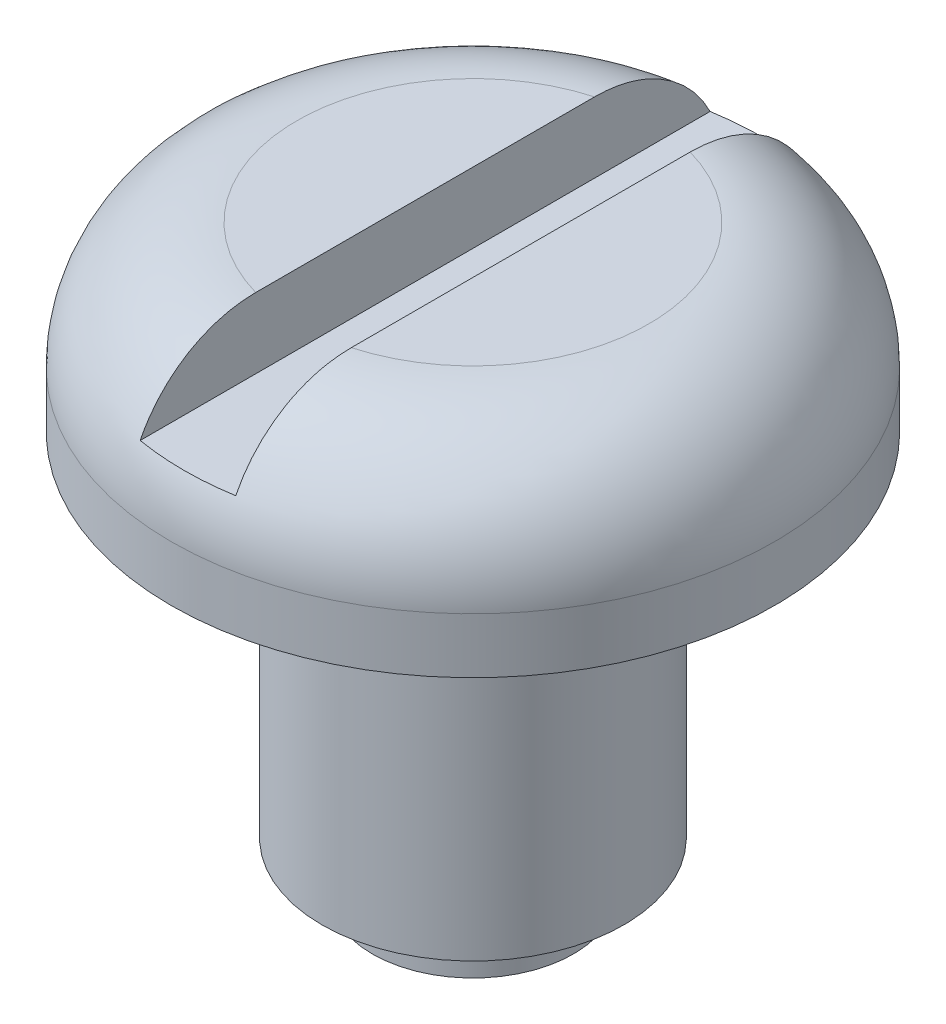
ISO-10303-21;
HEADER;
FILE_DESCRIPTION(('STEP AP214'),'2;1');
FILE_NAME('part.step','',(''),(''),'','','');
FILE_SCHEMA(('AUTOMOTIVE_DESIGN { 1 0 10303 214 1 1 1 1 }'));
ENDSEC;
DATA;
#1=APPLICATION_CONTEXT('core data for automotive mechanical design processes');
#2=APPLICATION_PROTOCOL_DEFINITION('international standard','automotive_design',2000,#1);
#3=PRODUCT_CONTEXT('',#1,'mechanical');
#4=PRODUCT('Part','Part','',(#3));
#5=PRODUCT_RELATED_PRODUCT_CATEGORY('part','',(#4));
#6=PRODUCT_DEFINITION_FORMATION('','',#4);
#7=PRODUCT_DEFINITION_CONTEXT('part definition',#1,'design');
#8=PRODUCT_DEFINITION('design','',#6,#7);
#9=PRODUCT_DEFINITION_SHAPE('','',#8);
#10=(LENGTH_UNIT() NAMED_UNIT(*) SI_UNIT(.MILLI.,.METRE.));
#11=(NAMED_UNIT(*) PLANE_ANGLE_UNIT() SI_UNIT($,.RADIAN.));
#12=(NAMED_UNIT(*) SI_UNIT($,.STERADIAN.) SOLID_ANGLE_UNIT());
#13=UNCERTAINTY_MEASURE_WITH_UNIT(LENGTH_MEASURE(1.E-05),#10,'distance_accuracy_value','');
#14=(GEOMETRIC_REPRESENTATION_CONTEXT(3) GLOBAL_UNCERTAINTY_ASSIGNED_CONTEXT((#13)) GLOBAL_UNIT_ASSIGNED_CONTEXT((#10,
#11,#12)) REPRESENTATION_CONTEXT('',''));
#15=CARTESIAN_POINT('',(0.,0.,0.));
#16=DIRECTION('',(0.,0.,1.));
#17=DIRECTION('',(1.,0.,0.));
#18=AXIS2_PLACEMENT_3D('',#15,#16,#17);
#19=CARTESIAN_POINT('',(0.,0.,0.));
#20=DIRECTION('',(0.,1.,0.));
#21=DIRECTION('',(0.,0.,1.));
#22=AXIS2_PLACEMENT_3D('',#19,#20,#21);
#23=PLANE('',#22);
#24=DIRECTION('',(0.,0.,-1.));
#25=VECTOR('',#24,1.);
#26=CARTESIAN_POINT('',(0.949999999999999,0.,-6.24398384159058));
#27=LINE('',#26,#25);
#28=CARTESIAN_POINT('',(0.95,0.,3.36860505254029));
#29=VERTEX_POINT('',#28);
#30=CARTESIAN_POINT('',(0.949999999999999,0.,-3.36860505254029));
#31=VERTEX_POINT('',#30);
#32=EDGE_CURVE('E84',#29,#31,#27,.T.);
#33=ORIENTED_EDGE('',*,*,#32,.F.);
#34=CARTESIAN_POINT('',(0.,0.,0.));
#35=DIRECTION('',(0.,1.,0.));
#36=DIRECTION('',(0.,0.,1.));
#37=AXIS2_PLACEMENT_3D('',#34,#35,#36);
#38=CIRCLE('',#37,3.5);
#39=EDGE_CURVE('E94',#29,#31,#38,.T.);
#40=ORIENTED_EDGE('',*,*,#39,.T.);
#41=EDGE_LOOP('',(#33,#40));
#42=FACE_BOUND('',#41,.T.);
#43=ADVANCED_FACE('F37',(#42),#23,.T.);
#44=CARTESIAN_POINT('',(0.,-10.6,0.));
#45=DIRECTION('',(0.,1.,0.));
#46=DIRECTION('',(0.,0.,1.));
#47=AXIS2_PLACEMENT_3D('',#44,#45,#46);
#48=CYLINDRICAL_SURFACE('',#47,3.);
#49=CARTESIAN_POINT('',(0.,-10.6,0.));
#50=DIRECTION('',(0.,1.,0.));
#51=DIRECTION('',(0.,0.,1.));
#52=AXIS2_PLACEMENT_3D('',#49,#50,#51);
#53=CIRCLE('',#52,3.);
#54=CARTESIAN_POINT('',(0.,-10.6,3.));
#55=VERTEX_POINT('',#54);
#56=EDGE_CURVE('E147',#55,#55,#53,.T.);
#57=ORIENTED_EDGE('',*,*,#56,.T.);
#58=EDGE_LOOP('',(#57));
#59=FACE_BOUND('',#58,.T.);
#60=CARTESIAN_POINT('',(0.,-3.6,0.));
#61=DIRECTION('',(0.,1.,0.));
#62=DIRECTION('',(0.,0.,1.));
#63=AXIS2_PLACEMENT_3D('',#60,#61,#62);
#64=CIRCLE('',#63,3.);
#65=CARTESIAN_POINT('',(0.,-3.6,3.));
#66=VERTEX_POINT('',#65);
#67=EDGE_CURVE('E139',#66,#66,#64,.T.);
#68=ORIENTED_EDGE('',*,*,#67,.F.);
#69=EDGE_LOOP('',(#68));
#70=FACE_BOUND('',#69,.T.);
#71=ADVANCED_FACE('F168',(#59,#70),#48,.T.);
#72=CARTESIAN_POINT('',(0.,-11.6,0.));
#73=DIRECTION('',(0.,1.,0.));
#74=DIRECTION('',(0.,0.,1.));
#75=AXIS2_PLACEMENT_3D('',#72,#73,#74);
#76=CYLINDRICAL_SURFACE('',#75,2.);
#77=CARTESIAN_POINT('',(0.,-11.6,0.));
#78=DIRECTION('',(0.,1.,0.));
#79=DIRECTION('',(0.,0.,1.));
#80=AXIS2_PLACEMENT_3D('',#77,#78,#79);
#81=CIRCLE('',#80,2.);
#82=CARTESIAN_POINT('',(0.,-11.6,2.));
#83=VERTEX_POINT('',#82);
#84=EDGE_CURVE('E105',#83,#83,#81,.T.);
#85=ORIENTED_EDGE('',*,*,#84,.T.);
#86=EDGE_LOOP('',(#85));
#87=FACE_BOUND('',#86,.T.);
#88=CARTESIAN_POINT('',(0.,-10.6,0.));
#89=DIRECTION('',(0.,1.,0.));
#90=DIRECTION('',(0.,0.,1.));
#91=AXIS2_PLACEMENT_3D('',#88,#89,#90);
#92=CIRCLE('',#91,2.);
#93=CARTESIAN_POINT('',(0.,-10.6,2.));
#94=VERTEX_POINT('',#93);
#95=EDGE_CURVE('E145',#94,#94,#92,.T.);
#96=ORIENTED_EDGE('',*,*,#95,.F.);
#97=EDGE_LOOP('',(#96));
#98=FACE_BOUND('',#97,.T.);
#99=ADVANCED_FACE('F154',(#87,#98),#76,.T.);
#100=CARTESIAN_POINT('',(0.,-11.6,0.));
#101=DIRECTION('',(0.,1.,0.));
#102=DIRECTION('',(0.,0.,1.));
#103=AXIS2_PLACEMENT_3D('',#100,#101,#102);
#104=PLANE('',#103);
#105=ORIENTED_EDGE('',*,*,#84,.F.);
#106=EDGE_LOOP('',(#105));
#107=FACE_BOUND('',#106,.T.);
#108=ADVANCED_FACE('F157',(#107),#104,.F.);
#109=CARTESIAN_POINT('',(0.,-10.6,0.));
#110=DIRECTION('',(0.,1.,0.));
#111=DIRECTION('',(0.,0.,1.));
#112=AXIS2_PLACEMENT_3D('',#109,#110,#111);
#113=PLANE('',#112);
#114=ORIENTED_EDGE('',*,*,#95,.T.);
#115=EDGE_LOOP('',(#114));
#116=FACE_BOUND('',#115,.T.);
#117=ORIENTED_EDGE('',*,*,#56,.F.);
#118=EDGE_LOOP('',(#117));
#119=FACE_BOUND('',#118,.T.);
#120=ADVANCED_FACE('F159',(#116,#119),#113,.F.);
#121=CARTESIAN_POINT('',(0.,-3.6,0.));
#122=DIRECTION('',(0.,1.,0.));
#123=DIRECTION('',(0.,0.,1.));
#124=AXIS2_PLACEMENT_3D('',#121,#122,#123);
#125=CYLINDRICAL_SURFACE('',#124,6.);
#126=CARTESIAN_POINT('',(0.,-2.5,0.));
#127=DIRECTION('',(0.,1.,0.));
#128=DIRECTION('',(0.,0.,1.));
#129=AXIS2_PLACEMENT_3D('',#126,#127,#128);
#130=CIRCLE('',#129,6.);
#131=CARTESIAN_POINT('',(0.,-2.5,6.));
#132=VERTEX_POINT('',#131);
#133=EDGE_CURVE('E98',#132,#132,#130,.F.);
#134=ORIENTED_EDGE('',*,*,#133,.T.);
#135=EDGE_LOOP('',(#134));
#136=FACE_BOUND('',#135,.T.);
#137=CARTESIAN_POINT('',(0.,-3.6,0.));
#138=DIRECTION('',(0.,1.,0.));
#139=DIRECTION('',(0.,0.,1.));
#140=AXIS2_PLACEMENT_3D('',#137,#138,#139);
#141=CIRCLE('',#140,6.);
#142=CARTESIAN_POINT('',(0.,-3.6,6.));
#143=VERTEX_POINT('',#142);
#144=EDGE_CURVE('E142',#143,#143,#141,.T.);
#145=ORIENTED_EDGE('',*,*,#144,.T.);
#146=EDGE_LOOP('',(#145));
#147=FACE_BOUND('',#146,.T.);
#148=ADVANCED_FACE('F165',(#136,#147),#125,.T.);
#149=CARTESIAN_POINT('',(0.,-3.6,0.));
#150=DIRECTION('',(0.,1.,0.));
#151=DIRECTION('',(0.,0.,1.));
#152=AXIS2_PLACEMENT_3D('',#149,#150,#151);
#153=PLANE('',#152);
#154=ORIENTED_EDGE('',*,*,#67,.T.);
#155=EDGE_LOOP('',(#154));
#156=FACE_BOUND('',#155,.T.);
#157=ORIENTED_EDGE('',*,*,#144,.F.);
#158=EDGE_LOOP('',(#157));
#159=FACE_BOUND('',#158,.T.);
#160=ADVANCED_FACE('F176',(#156,#159),#153,.F.);
#161=DIRECTION('',(0.,0.,1.));
#162=VECTOR('',#161,1.);
#163=CARTESIAN_POINT('',(-0.950000000000001,0.,-6.24398384159058));
#164=LINE('',#163,#162);
#165=CARTESIAN_POINT('',(-0.950000000000001,0.,-3.36860505254029));
#166=VERTEX_POINT('',#165);
#167=CARTESIAN_POINT('',(-0.95,0.,3.36860505254029));
#168=VERTEX_POINT('',#167);
#169=EDGE_CURVE('E95',#166,#168,#164,.T.);
#170=ORIENTED_EDGE('',*,*,#169,.F.);
#171=EDGE_CURVE('E99',#166,#168,#38,.T.);
#172=ORIENTED_EDGE('',*,*,#171,.T.);
#173=EDGE_LOOP('',(#170,#172));
#174=FACE_BOUND('',#173,.T.);
#175=ADVANCED_FACE('F134',(#174),#23,.T.);
#176=CARTESIAN_POINT('',(0.,-2.5,0.));
#177=DIRECTION('',(0.,1.,0.));
#178=DIRECTION('',(0.,0.,1.));
#179=AXIS2_PLACEMENT_3D('',#176,#177,#178);
#180=TOROIDAL_SURFACE('',#179,3.5,2.5);
#181=CARTESIAN_POINT('',(0.949999999999999,-0.750278155002776,-5.19955588899603));
#182=CARTESIAN_POINT('',(0.949999999999999,-0.849122328006773,-5.29800763159641));
#183=CARTESIAN_POINT('',(0.949999999999999,-0.956347875825854,-5.38831233170377));
#184=CARTESIAN_POINT('',(0.949999999999999,-1.18457190368671,-5.54980412966356));
#185=CARTESIAN_POINT('',(0.949999999999999,-1.30559845513093,-5.6209512365935));
#186=CARTESIAN_POINT('',(0.949999999999999,-1.55786944356676,-5.74182620440004));
#187=CARTESIAN_POINT('',(0.949999999999999,-1.68910875391873,-5.7915647311786));
#188=CARTESIAN_POINT('',(0.949999999999999,-1.95803726368413,-5.86814331422495));
#189=CARTESIAN_POINT('',(0.949999999999999,-2.09572342940213,-5.89499402880635));
#190=CARTESIAN_POINT('',(0.949999999999999,-2.37295754001086,-5.92496195089261));
#191=CARTESIAN_POINT('',(0.949999999999999,-2.51249272501454,-5.92819721868451));
#192=CARTESIAN_POINT('',(0.949999999999999,-2.79012730479672,-5.91114790908779));
#193=CARTESIAN_POINT('',(0.949999999999999,-2.92822661174148,-5.89086190132657));
#194=CARTESIAN_POINT('',(0.949999999999999,-3.19879629623566,-5.82743093197578));
#195=CARTESIAN_POINT('',(0.949999999999999,-3.33127669575111,-5.78432869241806));
#196=CARTESIAN_POINT('',(0.949999999999999,-3.58715235382669,-5.67656519754043));
#197=CARTESIAN_POINT('',(0.949999999999999,-3.71054765578141,-5.6119040452039));
#198=CARTESIAN_POINT('',(0.949999999999999,-3.94521798683822,-5.46267126992815));
#199=CARTESIAN_POINT('',(0.949999999999999,-4.05645143009411,-5.37803427738114));
#200=CARTESIAN_POINT('',(0.949999999999999,-4.26328710452976,-5.19144378509911));
#201=CARTESIAN_POINT('',(0.949999999999999,-4.35888896828059,-5.08948987843525));
#202=CARTESIAN_POINT('',(0.949999999999999,-4.53274922521666,-4.8701908757355));
#203=CARTESIAN_POINT('',(0.949999999999999,-4.6108385556837,-4.75271181273097));
#204=CARTESIAN_POINT('',(0.949999999999999,-4.74657132361042,-4.50649476779342));
#205=CARTESIAN_POINT('',(0.949999999999999,-4.80421352931359,-4.37775610815248));
#206=CARTESIAN_POINT('',(0.949999999999999,-4.89860936700827,-4.11026658901082));
#207=CARTESIAN_POINT('',(0.949999999999999,-4.93497344036266,-3.97137842536073));
#208=CARTESIAN_POINT('',(0.949999999999999,-4.98462947012715,-3.68955907886564));
#209=CARTESIAN_POINT('',(0.949999999999999,-4.99791951602991,-3.54662756223057));
#210=CARTESIAN_POINT('',(0.949999999999999,-5.00168645984268,-3.25593391803148));
#211=CARTESIAN_POINT('',(0.95,-4.99142440513347,-3.10816272502631));
#212=CARTESIAN_POINT('',(0.95,-4.94760288523625,-2.81615026364774));
#213=CARTESIAN_POINT('',(0.95,-4.91403938608277,-2.67190961096131));
#214=CARTESIAN_POINT('',(0.95,-4.82284530502384,-2.38212891508809));
#215=CARTESIAN_POINT('',(0.95,-4.76394115077081,-2.23699157060508));
#216=CARTESIAN_POINT('',(0.95,-4.62491160796276,-1.95732397393391));
#217=CARTESIAN_POINT('',(0.95,-4.54477955742965,-1.82279706886343));
#218=CARTESIAN_POINT('',(0.95,-4.35683792440032,-1.55222905226473));
#219=CARTESIAN_POINT('',(0.95,-4.24695813005303,-1.41763604462924));
#220=CARTESIAN_POINT('',(0.95,-4.00983026178872,-1.16487652192887));
#221=CARTESIAN_POINT('',(0.95,-3.88258142524116,-1.04671072860135));
#222=CARTESIAN_POINT('',(0.95,-3.69455281626652,-0.892317018109478));
#223=CARTESIAN_POINT('',(0.95,-3.63928763125733,-0.849179664234029));
#224=CARTESIAN_POINT('',(0.95,-3.52673150832464,-0.765639982902658));
#225=CARTESIAN_POINT('',(0.95,-3.46944103711126,-0.725237031500983));
#226=CARTESIAN_POINT('',(0.95,-3.35271649726799,-0.647216321821813));
#227=CARTESIAN_POINT('',(0.95,-3.29327588795107,-0.60960835184053));
#228=CARTESIAN_POINT('',(0.95,-3.17234100333466,-0.537886095212401));
#229=CARTESIAN_POINT('',(0.95,-3.11084786535478,-0.503769915000162));
#230=CARTESIAN_POINT('',(0.95,-2.98371684170401,-0.439532136706452));
#231=CARTESIAN_POINT('',(0.95,-2.9180122353906,-0.40954080384731));
#232=CARTESIAN_POINT('',(0.95,-2.78342470749218,-0.358722250401548));
#233=CARTESIAN_POINT('',(0.95,-2.71457431319477,-0.337817766617754));
#234=CARTESIAN_POINT('',(0.95,-2.59442768431797,-0.316503347174443));
#235=CARTESIAN_POINT('',(0.95,-2.54396021561051,-0.311861256103883));
#236=CARTESIAN_POINT('',(0.95,-2.4431124175703,-0.312692061766517));
#237=CARTESIAN_POINT('',(0.95,-2.39273209962078,-0.318166192706453));
#238=CARTESIAN_POINT('',(0.95,-2.27052948581263,-0.34161636080205));
#239=CARTESIAN_POINT('',(0.95,-2.19968967592796,-0.364239389341609));
#240=CARTESIAN_POINT('',(0.95,-2.06118352958471,-0.418542699130335));
#241=CARTESIAN_POINT('',(0.95,-1.99355473286209,-0.450308880894088));
#242=CARTESIAN_POINT('',(0.95,-1.87809469492421,-0.510147055623446));
#243=CARTESIAN_POINT('',(0.95,-1.82965508441744,-0.537059552107383));
#244=CARTESIAN_POINT('',(0.95,-1.73408205999511,-0.593120880199274));
#245=CARTESIAN_POINT('',(0.95,-1.68694899713386,-0.622270305066125));
#246=CARTESIAN_POINT('',(0.95,-1.54726790438153,-0.712607182262991));
#247=CARTESIAN_POINT('',(0.95,-1.45653807640824,-0.776629407409996));
#248=CARTESIAN_POINT('',(0.95,-1.28050408442852,-0.911199467165006));
#249=CARTESIAN_POINT('',(0.95,-1.19518450566597,-0.981727213372513));
#250=CARTESIAN_POINT('',(0.95,-1.03058977539037,-1.12941383971957));
#251=CARTESIAN_POINT('',(0.95,-0.95130917219299,-1.20656660197433));
#252=CARTESIAN_POINT('',(0.95,-0.812294903739576,-1.35426653670713));
#253=CARTESIAN_POINT('',(0.95,-0.751492588016033,-1.42380834630388));
#254=CARTESIAN_POINT('',(0.95,-0.635496770970729,-1.56745587162147));
#255=CARTESIAN_POINT('',(0.95,-0.580303991082746,-1.64156217241116));
#256=CARTESIAN_POINT('',(0.95,-0.476297130592358,-1.79403251740646));
#257=CARTESIAN_POINT('',(0.95,-0.427477030710069,-1.8723924433355));
#258=CARTESIAN_POINT('',(0.95,-0.336845288657013,-2.03307210343633));
#259=CARTESIAN_POINT('',(0.95,-0.295033270111858,-2.11539162464922));
#260=CARTESIAN_POINT('',(0.95,-0.218755501844671,-2.28417704813316));
#261=CARTESIAN_POINT('',(0.95,-0.184351527972232,-2.37067096922886));
#262=CARTESIAN_POINT('',(0.95,-0.123916460723859,-2.54653350691623));
#263=CARTESIAN_POINT('',(0.95,-0.097884492067778,-2.63590182191915));
#264=CARTESIAN_POINT('',(0.95,-0.0546930420973217,-2.81678655696861));
#265=CARTESIAN_POINT('',(0.95,-0.0375347996100654,-2.90830327508218));
#266=CARTESIAN_POINT('',(0.95,-0.0124926389048757,-3.09256008004325));
#267=CARTESIAN_POINT('',(0.949999999999999,-0.00460717570843742,-3.18529996048978));
#268=CARTESIAN_POINT('',(0.949999999999999,0.00385062238025159,-3.43912102275288));
#269=CARTESIAN_POINT('',(0.949999999999999,-0.00512752126397407,-3.60063559073296));
#270=CARTESIAN_POINT('',(0.949999999999999,-0.052391258739314,-3.91927520588929));
#271=CARTESIAN_POINT('',(0.949999999999999,-0.0906705627527217,-4.0764011876222));
#272=CARTESIAN_POINT('',(0.949999999999999,-0.191808853398552,-4.36936522598758));
#273=CARTESIAN_POINT('',(0.949999999999999,-0.252612250150836,-4.50591628290906));
#274=CARTESIAN_POINT('',(0.949999999999999,-0.397053235664409,-4.7660817003362));
#275=CARTESIAN_POINT('',(0.949999999999999,-0.480633017494121,-4.88972772992276));
#276=CARTESIAN_POINT('',(0.949999999999999,-0.601907036936907,-5.03884638843969));
#277=CARTESIAN_POINT('',(0.949999999999999,-0.630399925267704,-5.07206612914828));
#278=CARTESIAN_POINT('',(0.949999999999999,-0.68907955839954,-5.13697655373738));
#279=CARTESIAN_POINT('',(0.949999999999999,-0.719266343946374,-5.16866720080221));
#280=CARTESIAN_POINT('',(0.949999999999999,-0.750278155002776,-5.19955588899603));
#281=B_SPLINE_CURVE_WITH_KNOTS('',3,(#181,#182,#183,#184,#185,#186,#187,#188,#189,#190,#191,
#192,#193,#194,#195,#196,#197,#198,#199,#200,#201,#202,#203,#204,#205,#206,#207,#208,#209,#210,
#211,#212,#213,#214,#215,#216,#217,#218,#219,#220,#221,#222,#223,#224,#225,#226,#227,#228,#229,
#230,#231,#232,#233,#234,#235,#236,#237,#238,#239,#240,#241,#242,#243,#244,#245,#246,#247,#248,
#249,#250,#251,#252,#253,#254,#255,#256,#257,#258,#259,#260,#261,#262,#263,#264,#265,#266,#267,
#268,#269,#270,#271,#272,#273,#274,#275,#276,#277,#278,#279,#280),.UNSPECIFIED.,.T.,.F.,(4,2,2,
2,2,2,2,2,2,2,2,2,2,2,2,2,2,2,2,2,2,2,2,2,2,2,2,2,2,2,2,2,2,2,2,2,2,2,2,2,2,2,2,2,2,2,2,2,2,4),
(0.,0.418362562328124,0.837591790645921,1.25661191363923,1.67543680209109,2.09216642341772,
2.50892138817859,2.92489875015763,3.34087412510966,3.75823010199613,4.1755958876562,
4.59683225670472,5.01809399717187,5.44684462279987,5.87563074687596,6.3180532680967,
6.76055240097795,7.22851022202178,7.69661507721043,8.21599245750634,8.73539264968439,
8.94566164436451,9.15588249620562,9.36680789588446,9.57761829977177,9.79403154588143,
10.0085668677883,10.1596700563821,10.3107916811951,10.5325372026223,10.7564381266918,
10.922605898758,11.0888178937351,11.421581815535,11.7533505582327,12.0848161570679,
12.3616814290105,12.6385822632323,12.9152196299993,13.1918421349803,13.4706889971881,
13.749506696905,14.028363310799,14.3071734565812,14.78965910088,15.2720412033411,
15.7182956810708,16.1634279378743,16.2946837127804,16.425942646329),.UNSPECIFIED.);
#282=CARTESIAN_POINT('',(0.949999999999999,-1.4,-5.66590337231854));
#283=VERTEX_POINT('',#282);
#284=EDGE_CURVE('E11',#31,#283,#281,.T.);
#285=ORIENTED_EDGE('',*,*,#284,.F.);
#286=ORIENTED_EDGE('',*,*,#39,.F.);
#287=CARTESIAN_POINT('',(0.95,-1.554530465839,0.709458798466109));
#288=CARTESIAN_POINT('',(0.95,-1.6034466736597,0.67606605578714));
#289=CARTESIAN_POINT('',(0.95,-1.65305275460665,0.643694753337373));
#290=CARTESIAN_POINT('',(0.95,-1.7537220899057,0.581231906114287));
#291=CARTESIAN_POINT('',(0.95,-1.80478601852376,0.551141440555127));
#292=CARTESIAN_POINT('',(0.95,-1.90842159655912,0.49386825838023));
#293=CARTESIAN_POINT('',(0.95,-1.96099043499692,0.466680518637562));
#294=CARTESIAN_POINT('',(0.95,-2.06800610914151,0.416396451883361));
#295=CARTESIAN_POINT('',(0.95,-2.12245063971829,0.393295302893011));
#296=CARTESIAN_POINT('',(0.95,-2.23275231481614,0.354197018160991));
#297=CARTESIAN_POINT('',(0.95,-2.28855578242858,0.338060882468451));
#298=CARTESIAN_POINT('',(0.95,-2.37354384668671,0.321897374707788));
#299=CARTESIAN_POINT('',(0.95,-2.40194882408881,0.317850138566784));
#300=CARTESIAN_POINT('',(0.95,-2.45902725796578,0.312813235185297));
#301=CARTESIAN_POINT('',(0.95,-2.48770058864636,0.311822200891739));
#302=CARTESIAN_POINT('',(0.95,-2.54509401284922,0.313021941807544));
#303=CARTESIAN_POINT('',(0.95,-2.57381382878753,0.315225561989491));
#304=CARTESIAN_POINT('',(0.95,-2.63088474725768,0.322571586620489));
#305=CARTESIAN_POINT('',(0.95,-2.65923550615106,0.327716553992008));
#306=CARTESIAN_POINT('',(0.95,-2.74403846559875,0.346909737595266));
#307=CARTESIAN_POINT('',(0.95,-2.79963500921456,0.364685209735694));
#308=CARTESIAN_POINT('',(0.95,-2.89159435870866,0.399684260478166));
#309=CARTESIAN_POINT('',(0.95,-2.92859240131664,0.415381447755577));
#310=CARTESIAN_POINT('',(0.95,-3.00167369597257,0.44881079019926));
#311=CARTESIAN_POINT('',(0.95,-3.03775673187911,0.466543420807195));
#312=CARTESIAN_POINT('',(0.95,-3.14494221647671,0.522071496686365));
#313=CARTESIAN_POINT('',(0.95,-3.21485628365761,0.562145365286962));
#314=CARTESIAN_POINT('',(0.95,-3.35214823838394,0.646586684194033));
#315=CARTESIAN_POINT('',(0.95,-3.41952204937889,0.690960659193436));
#316=CARTESIAN_POINT('',(0.95,-3.55159563890222,0.783377938284288));
#317=CARTESIAN_POINT('',(0.95,-3.61629820935663,0.831417253711663));
#318=CARTESIAN_POINT('',(0.95,-3.74940294018771,0.936163530503538));
#319=CARTESIAN_POINT('',(0.95,-3.81750454683856,0.993254214948544));
#320=CARTESIAN_POINT('',(0.95,-3.94986903636852,1.11174577563659));
#321=CARTESIAN_POINT('',(0.95,-4.01413061902799,1.17314809664999));
#322=CARTESIAN_POINT('',(0.95,-4.19982954170463,1.36336771569498));
#323=CARTESIAN_POINT('',(0.95,-4.31480767813452,1.49868323719126));
#324=CARTESIAN_POINT('',(0.95,-4.51907229222706,1.78114982164315));
#325=CARTESIAN_POINT('',(0.95,-4.6090503880837,1.92779774167795));
#326=CARTESIAN_POINT('',(0.95,-4.76366927865955,2.23430294383047));
#327=CARTESIAN_POINT('',(0.95,-4.82827488367809,2.39417820205053));
#328=CARTESIAN_POINT('',(0.95,-4.9284013024533,2.72372951534498));
#329=CARTESIAN_POINT('',(0.95,-4.96378118124327,2.89344888603852));
#330=CARTESIAN_POINT('',(0.95,-5.00218765003661,3.2364767251107));
#331=CARTESIAN_POINT('',(0.95,-5.00524089061791,3.40978211898179));
#332=CARTESIAN_POINT('',(0.95,-4.97914304668395,3.7371557442599));
#333=CARTESIAN_POINT('',(0.95,-4.95305963428099,3.89147169497375));
#334=CARTESIAN_POINT('',(0.95,-4.87371278995766,4.19297057836655));
#335=CARTESIAN_POINT('',(0.95,-4.82045688312184,4.3401554735525));
#336=CARTESIAN_POINT('',(0.95,-4.69197581413209,4.61409225675047));
#337=CARTESIAN_POINT('',(0.95,-4.61822301516296,4.74153632647836));
#338=CARTESIAN_POINT('',(0.95,-4.44975678413736,4.98171861603843));
#339=CARTESIAN_POINT('',(0.95,-4.35504822445525,5.09446024463159));
#340=CARTESIAN_POINT('',(0.95,-4.15046114873666,5.29860166600364));
#341=CARTESIAN_POINT('',(0.95,-4.04111226847508,5.3905327185642));
#342=CARTESIAN_POINT('',(0.95,-3.80832753044294,5.55438670958914));
#343=CARTESIAN_POINT('',(0.95,-3.68489287612007,5.62631135554068));
#344=CARTESIAN_POINT('',(0.95,-3.42952225953637,5.7469977543715));
#345=CARTESIAN_POINT('',(0.950000000000001,-3.29774761347,5.79610106665551));
#346=CARTESIAN_POINT('',(0.950000000000001,-3.02779025979257,5.87130088224025));
#347=CARTESIAN_POINT('',(0.950000000000001,-2.8896078860524,5.89739858282025));
#348=CARTESIAN_POINT('',(0.950000000000001,-2.61186061480444,5.92569674658171));
#349=CARTESIAN_POINT('',(0.950000000000001,-2.47231366012224,5.9280736150009));
#350=CARTESIAN_POINT('',(0.950000000000001,-2.19481020752166,5.909320189336));
#351=CARTESIAN_POINT('',(0.950000000000001,-2.0568536792079,5.88819034525466));
#352=CARTESIAN_POINT('',(0.950000000000001,-1.78669120799431,5.82310908549711));
#353=CARTESIAN_POINT('',(0.95,-1.65447566167206,5.77919750884529));
#354=CARTESIAN_POINT('',(0.95,-1.39925901628342,5.66987280886742));
#355=CARTESIAN_POINT('',(0.95,-1.27625796330673,5.6044595780017));
#356=CARTESIAN_POINT('',(0.95,-1.04248447216572,5.45379233435687));
#357=CARTESIAN_POINT('',(0.95,-0.931755192702808,5.36847138231582));
#358=CARTESIAN_POINT('',(0.95,-0.726032675678673,5.18060868673533));
#359=CARTESIAN_POINT('',(0.95,-0.631039775037234,5.07806657458119));
#360=CARTESIAN_POINT('',(0.95,-0.458477904084727,4.85768453052194));
#361=CARTESIAN_POINT('',(0.95,-0.3810809744977,4.73970995564541));
#362=CARTESIAN_POINT('',(0.95,-0.246799897548962,4.49262304045923));
#363=CARTESIAN_POINT('',(0.95,-0.189917303634777,4.36350985759581));
#364=CARTESIAN_POINT('',(0.95,-0.0970881602675819,4.09536773764496));
#365=CARTESIAN_POINT('',(0.95,-0.0615367233911907,3.95620218774804));
#366=CARTESIAN_POINT('',(0.95,-0.0135345282983029,3.67397300051942));
#367=CARTESIAN_POINT('',(0.95,-0.00108434276222339,3.53090926664088));
#368=CARTESIAN_POINT('',(0.95,0.000980743113522644,3.24004568749371));
#369=CARTESIAN_POINT('',(0.95,-0.0101494434326101,3.09224108546825));
#370=CARTESIAN_POINT('',(0.95,-0.0556908302395417,2.80026632774553));
#371=CARTESIAN_POINT('',(0.95,-0.0901106519828269,2.65609753848069));
#372=CARTESIAN_POINT('',(0.95,-0.183054978040634,2.36647564673932));
#373=CARTESIAN_POINT('',(0.95,-0.242869305352033,2.22143884986412));
#374=CARTESIAN_POINT('',(0.95,-0.383657168512964,1.94215678802275));
#375=CARTESIAN_POINT('',(0.95,-0.464625393815485,1.80790882563538));
#376=CARTESIAN_POINT('',(0.95,-0.621430621776059,1.58466203944219));
#377=CARTESIAN_POINT('',(0.95,-0.693326485782904,1.49284431340644));
#378=CARTESIAN_POINT('',(0.95,-0.845642841456269,1.31647544155604));
#379=CARTESIAN_POINT('',(0.95,-0.926069232157584,1.23192939839244));
#380=CARTESIAN_POINT('',(0.95,-1.09437626267341,1.0699645630821));
#381=CARTESIAN_POINT('',(0.95,-1.18228540045797,0.992575595781683));
#382=CARTESIAN_POINT('',(0.95,-1.3640795577467,0.845286920188373));
#383=CARTESIAN_POINT('',(0.95,-1.45796064899966,0.775382368340759));
#384=CARTESIAN_POINT('',(0.95,-1.554530465839,0.709458798466109));
#385=B_SPLINE_CURVE_WITH_KNOTS('',3,(#287,#288,#289,#290,#291,#292,#293,#294,#295,#296,#297,
#298,#299,#300,#301,#302,#303,#304,#305,#306,#307,#308,#309,#310,#311,#312,#313,#314,#315,#316,
#317,#318,#319,#320,#321,#322,#323,#324,#325,#326,#327,#328,#329,#330,#331,#332,#333,#334,#335,
#336,#337,#338,#339,#340,#341,#342,#343,#344,#345,#346,#347,#348,#349,#350,#351,#352,#353,#354,
#355,#356,#357,#358,#359,#360,#361,#362,#363,#364,#365,#366,#367,#368,#369,#370,#371,#372,#373,
#374,#375,#376,#377,#378,#379,#380,#381,#382,#383,#384),.UNSPECIFIED.,.T.,.F.,(4,2,2,2,2,2,2,2,
2,2,2,2,2,2,2,2,2,2,2,2,2,2,2,2,2,2,2,2,2,2,2,2,2,2,2,2,2,2,2,2,2,2,2,2,2,2,2,2,4),(0.,
0.177655756537929,0.355395055670831,0.532821616293984,0.710037405101502,0.883531567597334,
0.96946446712343,1.05535892289078,1.14159969986367,1.22791573692146,1.40234084385774,
1.52287349851684,1.6434343648729,1.88495969317281,2.12685741160317,2.36849554904842,
2.63490109817326,2.90139634610743,3.43202748495073,3.94604664963631,4.46077622294368,
4.9779737162485,5.49474479074874,5.96183726821442,6.42880046037927,6.86836508275284,
7.30782761019002,7.73433230374294,8.16080058521491,8.5806623882107,9.00050233908072,
9.41721770931892,9.83392510226834,10.2499062318988,10.665889442074,11.0832920735747,
11.5007036406148,11.9220358821446,12.3434000223514,12.7723456703611,13.2013019517986,
13.6440140346573,14.0868900927837,14.5556190966893,15.0242305421409,15.3735452802335,
15.7231031712981,16.0740576411804,16.4247835995827),.UNSPECIFIED.);
#386=CARTESIAN_POINT('',(0.95,-1.4,5.66590337231854));
#387=VERTEX_POINT('',#386);
#388=EDGE_CURVE('E81',#387,#29,#385,.T.);
#389=ORIENTED_EDGE('',*,*,#388,.F.);
#390=CARTESIAN_POINT('',(0.,-1.4,0.));
#391=DIRECTION('',(0.,1.,0.));
#392=DIRECTION('',(0.,0.,1.));
#393=AXIS2_PLACEMENT_3D('',#390,#391,#392);
#394=CIRCLE('',#393,5.74499443206436);
#395=CARTESIAN_POINT('',(-0.95,-1.4,5.66590337231854));
#396=VERTEX_POINT('',#395);
#397=EDGE_CURVE('E102',#387,#396,#394,.F.);
#398=ORIENTED_EDGE('',*,*,#397,.T.);
#399=CARTESIAN_POINT('',(-0.95,-1.554530465839,0.709458798466109));
#400=CARTESIAN_POINT('',(-0.95,-1.45838595125691,0.775091859484982));
#401=CARTESIAN_POINT('',(-0.95,-1.36490556667036,0.844672755084912));
#402=CARTESIAN_POINT('',(-0.95,-1.18386409968586,0.991242509142393));
#403=CARTESIAN_POINT('',(-0.95,-1.09630646533414,1.06823562063631));
#404=CARTESIAN_POINT('',(-0.95,-0.928439179922985,1.22952391796089));
#405=CARTESIAN_POINT('',(-0.95,-0.848116983292829,1.31380594778878));
#406=CARTESIAN_POINT('',(-0.95,-0.695950764585677,1.48961675834651));
#407=CARTESIAN_POINT('',(-0.95,-0.624101657022751,1.58114113657721));
#408=CARTESIAN_POINT('',(-0.95,-0.459571265544291,1.81470823884873));
#409=CARTESIAN_POINT('',(-0.95,-0.372387643445794,1.96071394098347));
#410=CARTESIAN_POINT('',(-0.95,-0.223193168863168,2.26513697220366));
#411=CARTESIAN_POINT('',(-0.95,-0.161180225628928,2.42355326912427));
#412=CARTESIAN_POINT('',(-0.95,-0.0656295319167143,2.74972849660206));
#413=CARTESIAN_POINT('',(-0.95,-0.0322367845656547,2.91753046682718));
#414=CARTESIAN_POINT('',(-0.95,0.00296176045771817,3.25645471967969));
#415=CARTESIAN_POINT('',(-0.95,0.00477832408900005,3.4275758507107));
#416=CARTESIAN_POINT('',(-0.95,-0.023029468446235,3.75233836506555));
#417=CARTESIAN_POINT('',(-0.95,-0.0499522218851441,3.90621310330305));
#418=CARTESIAN_POINT('',(-0.95,-0.130848895299173,4.20668356061964));
#419=CARTESIAN_POINT('',(-0.95,-0.184813133002113,4.35328186441092));
#420=CARTESIAN_POINT('',(-0.95,-0.314599640979758,4.62615834253519));
#421=CARTESIAN_POINT('',(-0.95,-0.388987885313159,4.75312008164712));
#422=CARTESIAN_POINT('',(-0.95,-0.558627010518582,4.99224318545331));
#423=CARTESIAN_POINT('',(-0.95,-0.65387356875364,5.10440760900869));
#424=CARTESIAN_POINT('',(-0.95,-0.859438039510227,5.30736689464927));
#425=CARTESIAN_POINT('',(-0.95,-0.969234959091581,5.39868989538579));
#426=CARTESIAN_POINT('',(-0.95,-1.20280285078218,5.56126326460205));
#427=CARTESIAN_POINT('',(-0.95,-1.32657257424553,5.63251542467825));
#428=CARTESIAN_POINT('',(-0.95,-1.58250729193117,5.75183469943053));
#429=CARTESIAN_POINT('',(-0.95,-1.71451444874263,5.80024058368454));
#430=CARTESIAN_POINT('',(-0.95,-1.98481508921685,5.87401876732446));
#431=CARTESIAN_POINT('',(-0.95,-2.12310825412459,5.89939223328805));
#432=CARTESIAN_POINT('',(-0.95,-2.40096620075493,5.92624384463204));
#433=CARTESIAN_POINT('',(-0.95,-2.54051418704508,5.92789609399271));
#434=CARTESIAN_POINT('',(-0.95,-2.81789806227191,5.90770553681245));
#435=CARTESIAN_POINT('',(-0.95,-2.95573398350726,5.88586317418803));
#436=CARTESIAN_POINT('',(-0.95,-3.22554919437497,5.81938858149042));
#437=CARTESIAN_POINT('',(-0.95,-3.35753784486506,5.77479432185196));
#438=CARTESIAN_POINT('',(-0.95,-3.61219063853661,5.66415361181912));
#439=CARTESIAN_POINT('',(-0.95,-3.73485472851791,5.59810703904249));
#440=CARTESIAN_POINT('',(-0.95,-3.96786362808714,5.44623228413078));
#441=CARTESIAN_POINT('',(-0.95,-4.07816388564361,5.36033577525491));
#442=CARTESIAN_POINT('',(-0.95,-4.28294028080255,5.17140327483297));
#443=CARTESIAN_POINT('',(-0.95,-4.37741610246116,5.06836694116238));
#444=CARTESIAN_POINT('',(-0.95,-4.54887647963242,4.84707530398478));
#445=CARTESIAN_POINT('',(-0.95,-4.62568641276077,4.7286847681752));
#446=CARTESIAN_POINT('',(-0.95,-4.75873710846734,4.4808691412487));
#447=CARTESIAN_POINT('',(-0.95,-4.81497614567519,4.35144312566032));
#448=CARTESIAN_POINT('',(-0.95,-4.90647818405451,4.08275790592384));
#449=CARTESIAN_POINT('',(-0.95,-4.94134153181674,3.9433627733875));
#450=CARTESIAN_POINT('',(-0.95,-4.98794517872605,3.66079407105546));
#451=CARTESIAN_POINT('',(-0.95,-4.99968554577119,3.51762051235593));
#452=CARTESIAN_POINT('',(-0.95,-5.00031183772172,3.22661284529155));
#453=CARTESIAN_POINT('',(-0.95,-4.98844683219268,3.07877766669755));
#454=CARTESIAN_POINT('',(-0.95,-4.94145107726683,2.78684131766155));
#455=CARTESIAN_POINT('',(-0.95,-4.90630945895816,2.64274192430777));
#456=CARTESIAN_POINT('',(-0.95,-4.8118897740761,2.353276697076));
#457=CARTESIAN_POINT('',(-0.95,-4.75130946299068,2.20833816429628));
#458=CARTESIAN_POINT('',(-0.95,-4.60904879408464,1.92939080105897));
#459=CARTESIAN_POINT('',(-0.95,-4.52737970013064,1.79537618607668));
#460=CARTESIAN_POINT('',(-0.95,-4.37533160330324,1.58093394840015));
#461=CARTESIAN_POINT('',(-0.95,-4.30969392931847,1.49707471044531));
#462=CARTESIAN_POINT('',(-0.95,-4.17126354896104,1.33541659777511));
#463=CARTESIAN_POINT('',(-0.95,-4.09846748032574,1.25762060198303));
#464=CARTESIAN_POINT('',(-0.95,-3.946509522725,1.10795591658475));
#465=CARTESIAN_POINT('',(-0.95,-3.86732459166713,1.03611076554769));
#466=CARTESIAN_POINT('',(-0.95,-3.70377564220248,0.898666550640063));
#467=CARTESIAN_POINT('',(-0.95,-3.61941414633836,0.833064483649094));
#468=CARTESIAN_POINT('',(-0.95,-3.47908775200888,0.732031229258654));
#469=CARTESIAN_POINT('',(-0.95,-3.4245361353335,0.694620283192354));
#470=CARTESIAN_POINT('',(-0.95,-3.31365192951037,0.622450017340431));
#471=CARTESIAN_POINT('',(-0.95,-3.2573183199813,0.587692257135055));
#472=CARTESIAN_POINT('',(-0.95,-3.14282332668663,0.521443349916079));
#473=CARTESIAN_POINT('',(-0.95,-3.08466399152383,0.489948700935205));
#474=CARTESIAN_POINT('',(-0.95,-2.9661454947908,0.431537921862342));
#475=CARTESIAN_POINT('',(-0.95,-2.90578937199491,0.404615738721217));
#476=CARTESIAN_POINT('',(-0.95,-2.78650773410591,0.360203875735402));
#477=CARTESIAN_POINT('',(-0.95,-2.72780523121637,0.342164805736639));
#478=CARTESIAN_POINT('',(-0.95,-2.6382508861869,0.323799729320931));
#479=CARTESIAN_POINT('',(-0.95,-2.60831366719118,0.319129179439443));
#480=CARTESIAN_POINT('',(-0.95,-2.54810585474542,0.3131644317699));
#481=CARTESIAN_POINT('',(-0.95,-2.51783544591527,0.311868450240878));
#482=CARTESIAN_POINT('',(-0.95,-2.45716866505154,0.312831402663353));
#483=CARTESIAN_POINT('',(-0.95,-2.42677265042868,0.315112061373014));
#484=CARTESIAN_POINT('',(-0.95,-2.36639614419568,0.322961053743863));
#485=CARTESIAN_POINT('',(-0.95,-2.33641609894786,0.328532675854674));
#486=CARTESIAN_POINT('',(-0.95,-2.24679463335151,0.349384289438447));
#487=CARTESIAN_POINT('',(-0.95,-2.18812977634585,0.368767994258208));
#488=CARTESIAN_POINT('',(-0.95,-2.07956513254143,0.41133916027927));
#489=CARTESIAN_POINT('',(-0.95,-2.02939796013909,0.433900175700815));
#490=CARTESIAN_POINT('',(-0.95,-1.93061961968766,0.482269253543376));
#491=CARTESIAN_POINT('',(-0.95,-1.88200946079226,0.508079370455369));
#492=CARTESIAN_POINT('',(-0.95,-1.78621362217417,0.56202703297475));
#493=CARTESIAN_POINT('',(-0.95,-1.73902586767153,0.590160939991447));
#494=CARTESIAN_POINT('',(-0.95,-1.64587096449353,0.648389508183921));
#495=CARTESIAN_POINT('',(-0.95,-1.59990403920323,0.678484524767775));
#496=CARTESIAN_POINT('',(-0.95,-1.554530465839,0.709458798466109));
#497=B_SPLINE_CURVE_WITH_KNOTS('',3,(#399,#400,#401,#402,#403,#404,#405,#406,#407,#408,#409,
#410,#411,#412,#413,#414,#415,#416,#417,#418,#419,#420,#421,#422,#423,#424,#425,#426,#427,#428,
#429,#430,#431,#432,#433,#434,#435,#436,#437,#438,#439,#440,#441,#442,#443,#444,#445,#446,#447,
#448,#449,#450,#451,#452,#453,#454,#455,#456,#457,#458,#459,#460,#461,#462,#463,#464,#465,#466,
#467,#468,#469,#470,#471,#472,#473,#474,#475,#476,#477,#478,#479,#480,#481,#482,#483,#484,#485,
#486,#487,#488,#489,#490,#491,#492,#493,#494,#495,#496),.UNSPECIFIED.,.T.,.F.,(4,2,2,2,2,2,2,2,
2,2,2,2,2,2,2,2,2,2,2,2,2,2,2,2,2,2,2,2,2,2,2,2,2,2,2,2,2,2,2,2,2,2,2,2,2,2,2,2,4),(0.,
0.34918460507152,0.698570775783006,1.04733898872569,1.39589679653997,1.90384150241778,
2.41174400828616,2.92220482305143,3.43249159183091,3.8987114228877,4.3647644418991,
4.80403984364897,5.24322429681047,5.66959098450321,6.09591960108078,6.51571081906869,
6.93548077370573,7.35216820106945,7.76884775551419,8.18483418088273,8.60082297943339,
9.01826558943038,9.43571653291336,9.85713172165769,10.278582248223,10.7076896443348,
11.1367957804187,11.5797708282356,12.0229528672575,12.4922942209394,12.9613854083281,
13.2804677051067,13.5997005957013,13.9201412533016,14.2404269813381,14.438805456114,
14.6372996566819,14.8355785775215,15.0335929346611,15.2169974061905,15.3077324695349,
15.3984195620819,15.4896596312919,15.580991025481,15.7655960743921,15.9305060052635,
16.0955207417305,16.260281825881,16.4250728528548),.UNSPECIFIED.);
#498=EDGE_CURVE('E90',#168,#396,#497,.T.);
#499=ORIENTED_EDGE('',*,*,#498,.F.);
#500=ORIENTED_EDGE('',*,*,#171,.F.);
#501=CARTESIAN_POINT('',(-0.950000000000001,-0.750278155002776,-5.19955588899603));
#502=CARTESIAN_POINT('',(-0.950000000000001,-0.648921365466257,-5.09859018769521));
#503=CARTESIAN_POINT('',(-0.950000000000001,-0.556220116562311,-4.98891119477848));
#504=CARTESIAN_POINT('',(-0.950000000000001,-0.390686569291481,-4.75545348095874));
#505=CARTESIAN_POINT('',(-0.950000000000001,-0.317859085892903,-4.63167135346074));
#506=CARTESIAN_POINT('',(-0.950000000000001,-0.193987707542838,-4.37382003917742));
#507=CARTESIAN_POINT('',(-0.950000000000001,-0.142921759803597,-4.23976142979213));
#508=CARTESIAN_POINT('',(-0.950000000000001,-0.0635449721099998,-3.9651039767229));
#509=CARTESIAN_POINT('',(-0.950000000000001,-0.0352328081562034,-3.82450551408427));
#510=CARTESIAN_POINT('',(-0.950000000000001,-0.00131582623707996,-3.53773138881076));
#511=CARTESIAN_POINT('',(-0.950000000000001,0.00381855936272626,-3.39150043736841));
#512=CARTESIAN_POINT('',(-0.950000000000001,-0.00939348545436447,-3.10011416813969));
#513=CARTESIAN_POINT('',(-0.950000000000001,-0.0277458935514288,-2.95495913364597));
#514=CARTESIAN_POINT('',(-0.950000000000001,-0.0880710205250504,-2.66246630618611));
#515=CARTESIAN_POINT('',(-0.950000000000001,-0.131125116362598,-2.51535277342011));
#516=CARTESIAN_POINT('',(-0.950000000000001,-0.239346699235553,-2.229605286332));
#517=CARTESIAN_POINT('',(-0.95,-0.304512290902858,-2.09097060641562));
#518=CARTESIAN_POINT('',(-0.95,-0.460716295523458,-1.81285894872169));
#519=CARTESIAN_POINT('',(-0.95,-0.553528585109173,-1.67438423703079));
#520=CARTESIAN_POINT('',(-0.95,-0.757972063588781,-1.41203054783174));
#521=CARTESIAN_POINT('',(-0.95,-0.869621231389777,-1.28816570849101));
#522=CARTESIAN_POINT('',(-0.95,-1.05835808629184,-1.1037510862565));
#523=CARTESIAN_POINT('',(-0.95,-1.13066004062521,-1.0381903339973));
#524=CARTESIAN_POINT('',(-0.95,-1.27970303899529,-0.912209499652878));
#525=CARTESIAN_POINT('',(-0.95,-1.35644705725811,-0.851792930380008));
#526=CARTESIAN_POINT('',(-0.95,-1.51406250495779,-0.736064250872218));
#527=CARTESIAN_POINT('',(-0.95,-1.59494576316423,-0.680768202604808));
#528=CARTESIAN_POINT('',(-0.95,-1.71910150629111,-0.60240915503327));
#529=CARTESIAN_POINT('',(-0.95,-1.76094108120695,-0.577062962758726));
#530=CARTESIAN_POINT('',(-0.95,-1.84565884365815,-0.528177028914774));
#531=CARTESIAN_POINT('',(-0.95,-1.88853684363472,-0.504636964279852));
#532=CARTESIAN_POINT('',(-0.95,-1.99773233677149,-0.448311490236689));
#533=CARTESIAN_POINT('',(-0.95,-2.06480436626739,-0.41696790510454));
#534=CARTESIAN_POINT('',(-0.95,-2.20218267538721,-0.363422275663798));
#535=CARTESIAN_POINT('',(-0.95,-2.27245406714276,-0.341139827601935));
#536=CARTESIAN_POINT('',(-0.95,-2.39411313046223,-0.317974763899731));
#537=CARTESIAN_POINT('',(-0.95,-2.44455507605586,-0.312585380044063));
#538=CARTESIAN_POINT('',(-0.95,-2.54548592177137,-0.311946181770881));
#539=CARTESIAN_POINT('',(-0.95,-2.59597478625551,-0.316691345851813));
#540=CARTESIAN_POINT('',(-0.95,-2.71645766735521,-0.338281556761907));
#541=CARTESIAN_POINT('',(-0.95,-2.78560260135845,-0.359418566626332));
#542=CARTESIAN_POINT('',(-0.95,-2.92084642040617,-0.410743771837347));
#543=CARTESIAN_POINT('',(-0.95,-2.98690784042247,-0.441020540698781));
#544=CARTESIAN_POINT('',(-0.95,-3.10040194217506,-0.498588938050587));
#545=CARTESIAN_POINT('',(-0.95,-3.14840609125588,-0.524771176928561));
#546=CARTESIAN_POINT('',(-0.95,-3.24312135048816,-0.579388521721125));
#547=CARTESIAN_POINT('',(-0.95,-3.2898320992431,-0.607824248893116));
#548=CARTESIAN_POINT('',(-0.95,-3.42829081364806,-0.69600164698018));
#549=CARTESIAN_POINT('',(-0.95,-3.51825960132368,-0.758557694857586));
#550=CARTESIAN_POINT('',(-0.95,-3.69299317082309,-0.890063769202399));
#551=CARTESIAN_POINT('',(-0.95,-3.77777133331626,-0.958996096258046));
#552=CARTESIAN_POINT('',(-0.95,-3.9415402040524,-1.10331616938133));
#553=CARTESIAN_POINT('',(-0.95,-4.02053624891084,-1.1786978200004));
#554=CARTESIAN_POINT('',(-0.95,-4.16069965692677,-1.32442976354171));
#555=CARTESIAN_POINT('',(-0.95,-4.22278332050547,-1.39389874995899));
#556=CARTESIAN_POINT('',(-0.95,-4.34134622749575,-1.53750182856111));
#557=CARTESIAN_POINT('',(-0.95,-4.39782462643188,-1.61163662094383));
#558=CARTESIAN_POINT('',(-0.95,-4.50437374506062,-1.76425905571648));
#559=CARTESIAN_POINT('',(-0.95,-4.55445195343253,-1.84274145400181));
#560=CARTESIAN_POINT('',(-0.95,-4.64756552324568,-2.00378472662512));
#561=CARTESIAN_POINT('',(-0.95,-4.69060131451494,-2.08634535165124));
#562=CARTESIAN_POINT('',(-0.95,-4.7692911844976,-2.25576363781548));
#563=CARTESIAN_POINT('',(-0.950000000000001,-4.80488070727581,-2.34265139334649));
#564=CARTESIAN_POINT('',(-0.950000000000001,-4.86759991228071,-2.51942567917498));
#565=CARTESIAN_POINT('',(-0.950000000000001,-4.89473051619342,-2.60931188157862));
#566=CARTESIAN_POINT('',(-0.950000000000001,-4.94001315212061,-2.79136330856469));
#567=CARTESIAN_POINT('',(-0.950000000000001,-4.9581624933345,-2.88352920747447));
#568=CARTESIAN_POINT('',(-0.950000000000001,-4.98505260102953,-3.06918566062187));
#569=CARTESIAN_POINT('',(-0.950000000000001,-4.9937949966308,-3.16267598265002));
#570=CARTESIAN_POINT('',(-0.950000000000001,-5.00434741583895,-3.41775173723048));
#571=CARTESIAN_POINT('',(-0.950000000000001,-4.99661854392917,-3.57984729902757));
#572=CARTESIAN_POINT('',(-0.950000000000001,-4.95168324023493,-3.89975571525107));
#573=CARTESIAN_POINT('',(-0.950000000000001,-4.9144999344833,-4.05757182917268));
#574=CARTESIAN_POINT('',(-0.950000000000001,-4.81538328519936,-4.35167511379955));
#575=CARTESIAN_POINT('',(-0.950000000000001,-4.75558651508377,-4.48868336026205));
#576=CARTESIAN_POINT('',(-0.950000000000001,-4.61298836132811,-4.75016012649691));
#577=CARTESIAN_POINT('',(-0.950000000000001,-4.53019158003898,-4.87463114821184));
#578=CARTESIAN_POINT('',(-0.950000000000001,-4.34736601686509,-5.10274219538045));
#579=CARTESIAN_POINT('',(-0.950000000000001,-4.24808105554095,-5.20697901341654));
#580=CARTESIAN_POINT('',(-0.950000000000001,-4.03312181492696,-5.39690370132507));
#581=CARTESIAN_POINT('',(-0.950000000000001,-3.91744963595415,-5.48259394472283));
#582=CARTESIAN_POINT('',(-0.950000000000001,-3.67540933576741,-5.63133820021385));
#583=CARTESIAN_POINT('',(-0.950000000000001,-3.54928694293923,-5.69479232628426));
#584=CARTESIAN_POINT('',(-0.950000000000001,-3.28810719691269,-5.79938945724632));
#585=CARTESIAN_POINT('',(-0.950000000000001,-3.15305041773499,-5.8405338939424));
#586=CARTESIAN_POINT('',(-0.950000000000001,-2.87924277403399,-5.89898262774744));
#587=CARTESIAN_POINT('',(-0.950000000000001,-2.7405402339935,-5.91651351539559));
#588=CARTESIAN_POINT('',(-0.950000000000001,-2.46216132925416,-5.9279520837431));
#589=CARTESIAN_POINT('',(-0.950000000000001,-2.32248496290725,-5.92185972445364));
#590=CARTESIAN_POINT('',(-0.950000000000001,-2.04662590270686,-5.8862948364704));
#591=CARTESIAN_POINT('',(-0.950000000000001,-1.91043300598151,-5.85690131029639));
#592=CARTESIAN_POINT('',(-0.950000000000001,-1.64492014228779,-5.77570478620763));
#593=CARTESIAN_POINT('',(-0.950000000000001,-1.51559905621713,-5.72390544980655));
#594=CARTESIAN_POINT('',(-0.950000000000001,-1.27327022213193,-5.60235865121457));
#595=CARTESIAN_POINT('',(-0.950000000000001,-1.15978194326545,-5.53356630204615));
#596=CARTESIAN_POINT('',(-0.950000000000001,-0.945153662323592,-5.37885276250308));
#597=CARTESIAN_POINT('',(-0.950000000000001,-0.844014440712565,-5.29293049041445));
#598=CARTESIAN_POINT('',(-0.950000000000001,-0.750278155002776,-5.19955588899603));
#599=B_SPLINE_CURVE_WITH_KNOTS('',3,(#501,#502,#503,#504,#505,#506,#507,#508,#509,#510,#511,
#512,#513,#514,#515,#516,#517,#518,#519,#520,#521,#522,#523,#524,#525,#526,#527,#528,#529,#530,
#531,#532,#533,#534,#535,#536,#537,#538,#539,#540,#541,#542,#543,#544,#545,#546,#547,#548,#549,
#550,#551,#552,#553,#554,#555,#556,#557,#558,#559,#560,#561,#562,#563,#564,#565,#566,#567,#568,
#569,#570,#571,#572,#573,#574,#575,#576,#577,#578,#579,#580,#581,#582,#583,#584,#585,#586,#587,
#588,#589,#590,#591,#592,#593,#594,#595,#596,#597,#598),.UNSPECIFIED.,.T.,.F.,(4,2,2,2,2,2,2,2,
2,2,2,2,2,2,2,2,2,2,2,2,2,2,2,2,2,2,2,2,2,2,2,2,2,2,2,2,2,2,2,2,2,2,2,2,2,2,2,2,4),(0.,
0.428708087571797,0.857519949482454,1.28589622102123,1.7142475643537,2.15125504366662,
2.58837376892343,3.0462720148785,3.50413102031456,4.00233602664379,4.50101926433228,
4.79361029065538,5.08639954267189,5.38007812841568,5.52679886451658,5.67349329491645,
5.8953402098089,6.11517320169051,6.26644518077817,6.41764222448124,6.63322193321211,
6.85096182060265,7.01492788848685,7.17893931799393,7.50731954097621,7.83481413075332,
8.16200254445252,8.44124748669176,8.72053443562955,8.99949154739422,9.27843162689037,
9.55969803469703,9.84093378492327,10.1222537428913,10.4035249732673,10.8875351684661,
11.3711657211769,11.8173923748037,12.2635298017725,12.6932961292217,13.1230074241261,
13.5445329190756,13.96603135791,14.3834556671181,14.8008806829317,15.2168964428244,
15.632844243905,16.0292948981075,16.4257705951623),.UNSPECIFIED.);
#600=CARTESIAN_POINT('',(-0.950000000000001,-1.4,-5.66590337231854));
#601=VERTEX_POINT('',#600);
#602=EDGE_CURVE('E50',#601,#166,#599,.T.);
#603=ORIENTED_EDGE('',*,*,#602,.F.);
#604=EDGE_CURVE('E62',#601,#283,#394,.F.);
#605=ORIENTED_EDGE('',*,*,#604,.T.);
#606=EDGE_LOOP('',(#285,#286,#389,#398,#499,#500,#603,#605));
#607=FACE_BOUND('',#606,.T.);
#608=ORIENTED_EDGE('',*,*,#133,.F.);
#609=EDGE_LOOP('',(#608));
#610=FACE_BOUND('',#609,.T.);
#611=ADVANCED_FACE('F39',(#607,#610),#180,.T.);
#612=CARTESIAN_POINT('',(0.949999999999999,-1.4,-6.24398384159058));
#613=DIRECTION('',(1.,0.,0.));
#614=DIRECTION('',(0.,0.,-1.));
#615=AXIS2_PLACEMENT_3D('',#612,#613,#614);
#616=PLANE('',#615);
#617=ORIENTED_EDGE('',*,*,#284,.T.);
#618=DIRECTION('',(0.,0.,-1.));
#619=VECTOR('',#618,1.);
#620=CARTESIAN_POINT('',(0.949999999999999,-1.4,-6.24398384159058));
#621=LINE('',#620,#619);
#622=EDGE_CURVE('E86',#387,#283,#621,.T.);
#623=ORIENTED_EDGE('',*,*,#622,.F.);
#624=ORIENTED_EDGE('',*,*,#388,.T.);
#625=ORIENTED_EDGE('',*,*,#32,.T.);
#626=EDGE_LOOP('',(#617,#623,#624,#625));
#627=FACE_BOUND('',#626,.T.);
#628=ADVANCED_FACE('F83',(#627),#616,.F.);
#629=CARTESIAN_POINT('',(-0.950000000000001,-1.4,-6.24398384159058));
#630=DIRECTION('',(-1.,0.,0.));
#631=DIRECTION('',(0.,0.,1.));
#632=AXIS2_PLACEMENT_3D('',#629,#630,#631);
#633=PLANE('',#632);
#634=ORIENTED_EDGE('',*,*,#602,.T.);
#635=ORIENTED_EDGE('',*,*,#169,.T.);
#636=ORIENTED_EDGE('',*,*,#498,.T.);
#637=DIRECTION('',(0.,0.,1.));
#638=VECTOR('',#637,1.);
#639=CARTESIAN_POINT('',(-0.950000000000001,-1.4,-6.24398384159058));
#640=LINE('',#639,#638);
#641=EDGE_CURVE('E57',#601,#396,#640,.T.);
#642=ORIENTED_EDGE('',*,*,#641,.F.);
#643=EDGE_LOOP('',(#634,#635,#636,#642));
#644=FACE_BOUND('',#643,.T.);
#645=ADVANCED_FACE('F117',(#644),#633,.F.);
#646=CARTESIAN_POINT('',(0.,-1.4,0.));
#647=DIRECTION('',(0.,1.,0.));
#648=DIRECTION('',(0.,0.,1.));
#649=AXIS2_PLACEMENT_3D('',#646,#647,#648);
#650=PLANE('',#649);
#651=ORIENTED_EDGE('',*,*,#641,.T.);
#652=ORIENTED_EDGE('',*,*,#397,.F.);
#653=ORIENTED_EDGE('',*,*,#622,.T.);
#654=ORIENTED_EDGE('',*,*,#604,.F.);
#655=EDGE_LOOP('',(#651,#652,#653,#654));
#656=FACE_BOUND('',#655,.T.);
#657=ADVANCED_FACE('F121',(#656),#650,.T.);
#658=CLOSED_SHELL('',(#43,#71,#99,#108,#120,#148,#160,#175,#611,#628,#645,#657));
#659=MANIFOLD_SOLID_BREP('B2',#658);
#660=ADVANCED_BREP_SHAPE_REPRESENTATION('',(#18,#659),#14);
#661=SHAPE_DEFINITION_REPRESENTATION(#9,#660);
ENDSEC;
END-ISO-10303-21;
